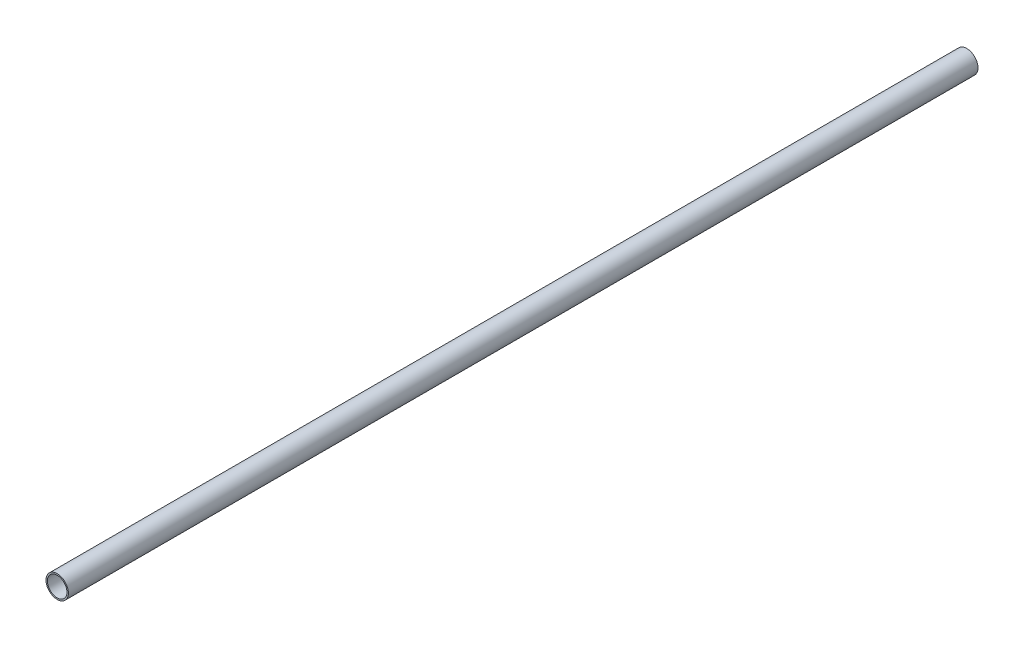
ISO-10303-21;
HEADER;
FILE_DESCRIPTION(('STEP AP214'),'2;1');
FILE_NAME('part.step','',(''),(''),'','','');
FILE_SCHEMA(('AUTOMOTIVE_DESIGN { 1 0 10303 214 1 1 1 1 }'));
ENDSEC;
DATA;
#1=APPLICATION_CONTEXT('core data for automotive mechanical design processes');
#2=APPLICATION_PROTOCOL_DEFINITION('international standard','automotive_design',2000,#1);
#3=PRODUCT_CONTEXT('',#1,'mechanical');
#4=PRODUCT('Part','Part','',(#3));
#5=PRODUCT_RELATED_PRODUCT_CATEGORY('part','',(#4));
#6=PRODUCT_DEFINITION_FORMATION('','',#4);
#7=PRODUCT_DEFINITION_CONTEXT('part definition',#1,'design');
#8=PRODUCT_DEFINITION('design','',#6,#7);
#9=PRODUCT_DEFINITION_SHAPE('','',#8);
#10=(LENGTH_UNIT() NAMED_UNIT(*) SI_UNIT(.MILLI.,.METRE.));
#11=(NAMED_UNIT(*) PLANE_ANGLE_UNIT() SI_UNIT($,.RADIAN.));
#12=(NAMED_UNIT(*) SI_UNIT($,.STERADIAN.) SOLID_ANGLE_UNIT());
#13=UNCERTAINTY_MEASURE_WITH_UNIT(LENGTH_MEASURE(1.E-05),#10,'distance_accuracy_value','');
#14=(GEOMETRIC_REPRESENTATION_CONTEXT(3) GLOBAL_UNCERTAINTY_ASSIGNED_CONTEXT((#13)) GLOBAL_UNIT_ASSIGNED_CONTEXT((#10,
#11,#12)) REPRESENTATION_CONTEXT('',''));
#15=CARTESIAN_POINT('',(0.,0.,0.));
#16=DIRECTION('',(0.,0.,1.));
#17=DIRECTION('',(1.,0.,0.));
#18=AXIS2_PLACEMENT_3D('',#15,#16,#17);
#19=CARTESIAN_POINT('',(0.,0.,325.));
#20=DIRECTION('',(0.,0.,1.));
#21=DIRECTION('',(1.,0.,0.));
#22=AXIS2_PLACEMENT_3D('',#19,#20,#21);
#23=PLANE('',#22);
#24=CARTESIAN_POINT('',(0.,0.,325.));
#25=DIRECTION('',(0.,0.,1.));
#26=DIRECTION('',(1.,0.,0.));
#27=AXIS2_PLACEMENT_3D('',#24,#25,#26);
#28=CIRCLE('',#27,8.);
#29=CARTESIAN_POINT('',(8.,0.,325.));
#30=VERTEX_POINT('',#29);
#31=EDGE_CURVE('E10',#30,#30,#28,.T.);
#32=ORIENTED_EDGE('',*,*,#31,.T.);
#33=EDGE_LOOP('',(#32));
#34=FACE_BOUND('',#33,.T.);
#35=CARTESIAN_POINT('',(0.,0.,325.));
#36=DIRECTION('',(0.,0.,1.));
#37=DIRECTION('',(1.,0.,0.));
#38=AXIS2_PLACEMENT_3D('',#35,#36,#37);
#39=CIRCLE('',#38,7.);
#40=CARTESIAN_POINT('',(7.,0.,325.));
#41=VERTEX_POINT('',#40);
#42=EDGE_CURVE('E41',#41,#41,#39,.T.);
#43=ORIENTED_EDGE('',*,*,#42,.F.);
#44=EDGE_LOOP('',(#43));
#45=FACE_BOUND('',#44,.T.);
#46=ADVANCED_FACE('F30',(#34,#45),#23,.T.);
#47=CARTESIAN_POINT('',(0.,0.,-325.));
#48=DIRECTION('',(0.,0.,1.));
#49=DIRECTION('',(1.,0.,0.));
#50=AXIS2_PLACEMENT_3D('',#47,#48,#49);
#51=PLANE('',#50);
#52=CARTESIAN_POINT('',(0.,0.,-325.));
#53=DIRECTION('',(0.,0.,1.));
#54=DIRECTION('',(1.,0.,0.));
#55=AXIS2_PLACEMENT_3D('',#52,#53,#54);
#56=CIRCLE('',#55,8.);
#57=CARTESIAN_POINT('',(8.,0.,-325.));
#58=VERTEX_POINT('',#57);
#59=EDGE_CURVE('E34',#58,#58,#56,.T.);
#60=ORIENTED_EDGE('',*,*,#59,.F.);
#61=EDGE_LOOP('',(#60));
#62=FACE_BOUND('',#61,.T.);
#63=CARTESIAN_POINT('',(0.,0.,-325.));
#64=DIRECTION('',(0.,0.,1.));
#65=DIRECTION('',(1.,0.,0.));
#66=AXIS2_PLACEMENT_3D('',#63,#64,#65);
#67=CIRCLE('',#66,7.);
#68=CARTESIAN_POINT('',(7.,0.,-325.));
#69=VERTEX_POINT('',#68);
#70=EDGE_CURVE('E43',#69,#69,#67,.T.);
#71=ORIENTED_EDGE('',*,*,#70,.T.);
#72=EDGE_LOOP('',(#71));
#73=FACE_BOUND('',#72,.T.);
#74=ADVANCED_FACE('F53',(#62,#73),#51,.F.);
#75=CARTESIAN_POINT('',(0.,0.,325.));
#76=DIRECTION('',(0.,0.,-1.));
#77=DIRECTION('',(-1.,0.,0.));
#78=AXIS2_PLACEMENT_3D('',#75,#76,#77);
#79=CYLINDRICAL_SURFACE('',#78,8.);
#80=ORIENTED_EDGE('',*,*,#31,.F.);
#81=EDGE_LOOP('',(#80));
#82=FACE_BOUND('',#81,.T.);
#83=ORIENTED_EDGE('',*,*,#59,.T.);
#84=EDGE_LOOP('',(#83));
#85=FACE_BOUND('',#84,.T.);
#86=ADVANCED_FACE('F32',(#82,#85),#79,.T.);
#87=CARTESIAN_POINT('',(0.,0.,325.));
#88=DIRECTION('',(0.,0.,-1.));
#89=DIRECTION('',(-1.,0.,0.));
#90=AXIS2_PLACEMENT_3D('',#87,#88,#89);
#91=CYLINDRICAL_SURFACE('',#90,7.);
#92=ORIENTED_EDGE('',*,*,#42,.T.);
#93=EDGE_LOOP('',(#92));
#94=FACE_BOUND('',#93,.T.);
#95=ORIENTED_EDGE('',*,*,#70,.F.);
#96=EDGE_LOOP('',(#95));
#97=FACE_BOUND('',#96,.T.);
#98=ADVANCED_FACE('F49',(#94,#97),#91,.F.);
#99=CLOSED_SHELL('',(#46,#74,#86,#98));
#100=MANIFOLD_SOLID_BREP('B2',#99);
#101=ADVANCED_BREP_SHAPE_REPRESENTATION('',(#18,#100),#14);
#102=SHAPE_DEFINITION_REPRESENTATION(#9,#101);
ENDSEC;
END-ISO-10303-21;
